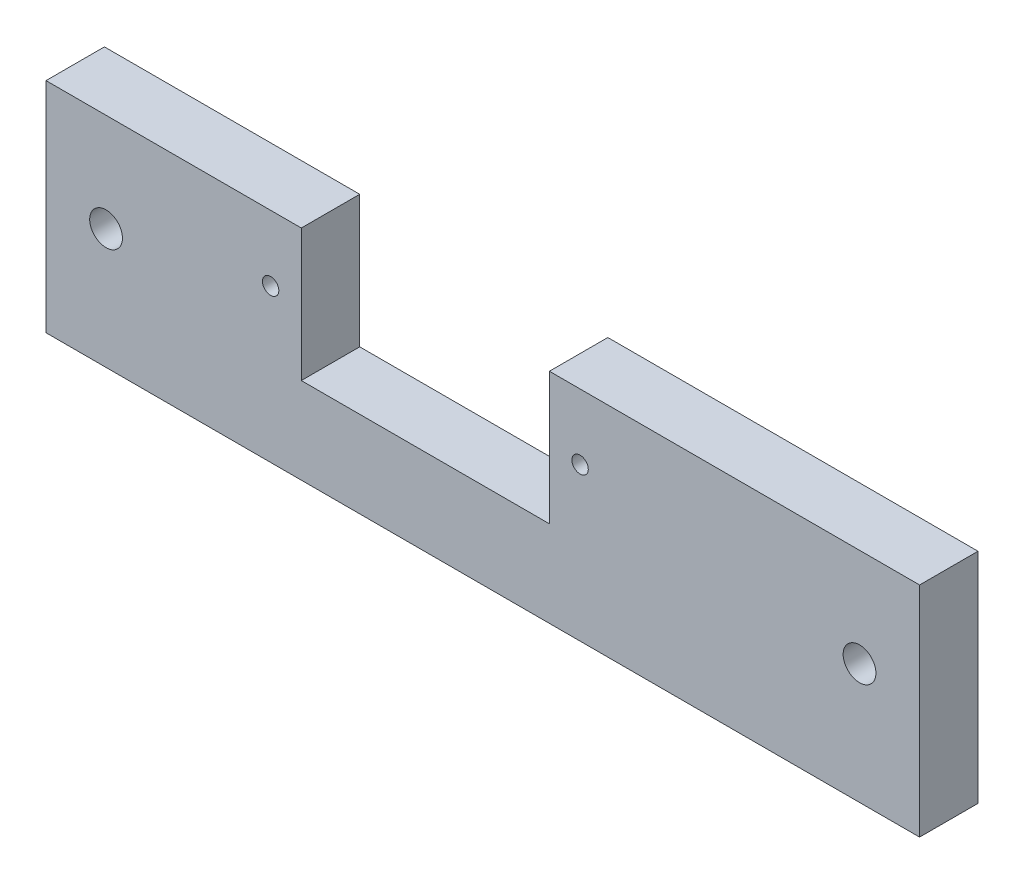
ISO-10303-21;
HEADER;
FILE_DESCRIPTION(('STEP AP214'),'2;1');
FILE_NAME('part.step','',(''),(''),'','','');
FILE_SCHEMA(('AUTOMOTIVE_DESIGN { 1 0 10303 214 1 1 1 1 }'));
ENDSEC;
DATA;
#1=APPLICATION_CONTEXT('core data for automotive mechanical design processes');
#2=APPLICATION_PROTOCOL_DEFINITION('international standard','automotive_design',2000,#1);
#3=PRODUCT_CONTEXT('',#1,'mechanical');
#4=PRODUCT('Part','Part','',(#3));
#5=PRODUCT_RELATED_PRODUCT_CATEGORY('part','',(#4));
#6=PRODUCT_DEFINITION_FORMATION('','',#4);
#7=PRODUCT_DEFINITION_CONTEXT('part definition',#1,'design');
#8=PRODUCT_DEFINITION('design','',#6,#7);
#9=PRODUCT_DEFINITION_SHAPE('','',#8);
#10=(LENGTH_UNIT() NAMED_UNIT(*) SI_UNIT(.MILLI.,.METRE.));
#11=(NAMED_UNIT(*) PLANE_ANGLE_UNIT() SI_UNIT($,.RADIAN.));
#12=(NAMED_UNIT(*) SI_UNIT($,.STERADIAN.) SOLID_ANGLE_UNIT());
#13=UNCERTAINTY_MEASURE_WITH_UNIT(LENGTH_MEASURE(1.E-05),#10,'distance_accuracy_value','');
#14=(GEOMETRIC_REPRESENTATION_CONTEXT(3) GLOBAL_UNCERTAINTY_ASSIGNED_CONTEXT((#13)) GLOBAL_UNIT_ASSIGNED_CONTEXT((#10,
#11,#12)) REPRESENTATION_CONTEXT('',''));
#15=CARTESIAN_POINT('',(0.,0.,0.));
#16=DIRECTION('',(0.,0.,1.));
#17=DIRECTION('',(1.,0.,0.));
#18=AXIS2_PLACEMENT_3D('',#15,#16,#17);
#19=CARTESIAN_POINT('',(0.,20.,5.35));
#20=DIRECTION('',(0.,1.,0.));
#21=DIRECTION('',(0.,0.,1.));
#22=AXIS2_PLACEMENT_3D('',#19,#20,#21);
#23=PLANE('',#22);
#24=DIRECTION('',(1.,0.,0.));
#25=VECTOR('',#24,1.);
#26=CARTESIAN_POINT('',(0.,20.,0.));
#27=LINE('',#26,#25);
#28=CARTESIAN_POINT('',(46.1,20.,0.));
#29=VERTEX_POINT('',#28);
#30=CARTESIAN_POINT('',(80.,20.,0.));
#31=VERTEX_POINT('',#30);
#32=EDGE_CURVE('E147',#29,#31,#27,.T.);
#33=ORIENTED_EDGE('',*,*,#32,.F.);
#34=DIRECTION('',(0.,0.,-1.));
#35=VECTOR('',#34,1.);
#36=CARTESIAN_POINT('',(46.1,20.,5.35));
#37=LINE('',#36,#35);
#38=CARTESIAN_POINT('',(46.1,20.,5.35));
#39=VERTEX_POINT('',#38);
#40=EDGE_CURVE('E11',#39,#29,#37,.T.);
#41=ORIENTED_EDGE('',*,*,#40,.F.);
#42=DIRECTION('',(1.,0.,0.));
#43=VECTOR('',#42,1.);
#44=CARTESIAN_POINT('',(0.,20.,5.35));
#45=LINE('',#44,#43);
#46=CARTESIAN_POINT('',(80.,20.,5.35));
#47=VERTEX_POINT('',#46);
#48=EDGE_CURVE('E200',#39,#47,#45,.T.);
#49=ORIENTED_EDGE('',*,*,#48,.T.);
#50=DIRECTION('',(0.,0.,-1.));
#51=VECTOR('',#50,1.);
#52=CARTESIAN_POINT('',(80.,20.,5.35));
#53=LINE('',#52,#51);
#54=EDGE_CURVE('E87',#47,#31,#53,.T.);
#55=ORIENTED_EDGE('',*,*,#54,.T.);
#56=EDGE_LOOP('',(#33,#41,#49,#55));
#57=FACE_BOUND('',#56,.T.);
#58=ADVANCED_FACE('F35',(#57),#23,.T.);
#59=CARTESIAN_POINT('',(46.1,0.,5.35));
#60=DIRECTION('',(1.,0.,0.));
#61=DIRECTION('',(0.,0.,-1.));
#62=AXIS2_PLACEMENT_3D('',#59,#60,#61);
#63=PLANE('',#62);
#64=DIRECTION('',(0.,-1.,0.));
#65=VECTOR('',#64,1.);
#66=CARTESIAN_POINT('',(46.1,0.,0.));
#67=LINE('',#66,#65);
#68=CARTESIAN_POINT('',(46.1,7.9,0.));
#69=VERTEX_POINT('',#68);
#70=EDGE_CURVE('E149',#29,#69,#67,.T.);
#71=ORIENTED_EDGE('',*,*,#70,.T.);
#72=DIRECTION('',(0.,0.,-1.));
#73=VECTOR('',#72,1.);
#74=CARTESIAN_POINT('',(46.1,7.9,5.35));
#75=LINE('',#74,#73);
#76=CARTESIAN_POINT('',(46.1,7.9,5.35));
#77=VERTEX_POINT('',#76);
#78=EDGE_CURVE('E44',#77,#69,#75,.T.);
#79=ORIENTED_EDGE('',*,*,#78,.F.);
#80=DIRECTION('',(0.,-1.,0.));
#81=VECTOR('',#80,1.);
#82=CARTESIAN_POINT('',(46.1,0.,5.35));
#83=LINE('',#82,#81);
#84=EDGE_CURVE('E198',#39,#77,#83,.T.);
#85=ORIENTED_EDGE('',*,*,#84,.F.);
#86=ORIENTED_EDGE('',*,*,#40,.T.);
#87=EDGE_LOOP('',(#71,#79,#85,#86));
#88=FACE_BOUND('',#87,.T.);
#89=ADVANCED_FACE('F190',(#88),#63,.F.);
#90=CARTESIAN_POINT('',(0.,7.9,5.35));
#91=DIRECTION('',(0.,1.,0.));
#92=DIRECTION('',(0.,0.,1.));
#93=AXIS2_PLACEMENT_3D('',#90,#91,#92);
#94=PLANE('',#93);
#95=DIRECTION('',(1.,0.,0.));
#96=VECTOR('',#95,1.);
#97=CARTESIAN_POINT('',(0.,7.9,0.));
#98=LINE('',#97,#96);
#99=CARTESIAN_POINT('',(23.38,7.9,0.));
#100=VERTEX_POINT('',#99);
#101=EDGE_CURVE('E152',#100,#69,#98,.T.);
#102=ORIENTED_EDGE('',*,*,#101,.F.);
#103=DIRECTION('',(0.,0.,-1.));
#104=VECTOR('',#103,1.);
#105=CARTESIAN_POINT('',(23.38,7.9,5.35));
#106=LINE('',#105,#104);
#107=CARTESIAN_POINT('',(23.38,7.9,5.35));
#108=VERTEX_POINT('',#107);
#109=EDGE_CURVE('E180',#108,#100,#106,.T.);
#110=ORIENTED_EDGE('',*,*,#109,.F.);
#111=DIRECTION('',(1.,0.,0.));
#112=VECTOR('',#111,1.);
#113=CARTESIAN_POINT('',(0.,7.9,5.35));
#114=LINE('',#113,#112);
#115=EDGE_CURVE('E187',#108,#77,#114,.T.);
#116=ORIENTED_EDGE('',*,*,#115,.T.);
#117=ORIENTED_EDGE('',*,*,#78,.T.);
#118=EDGE_LOOP('',(#102,#110,#116,#117));
#119=FACE_BOUND('',#118,.T.);
#120=ADVANCED_FACE('F185',(#119),#94,.T.);
#121=CARTESIAN_POINT('',(23.38,0.,5.35));
#122=DIRECTION('',(1.,0.,0.));
#123=DIRECTION('',(0.,0.,-1.));
#124=AXIS2_PLACEMENT_3D('',#121,#122,#123);
#125=PLANE('',#124);
#126=DIRECTION('',(0.,-1.,0.));
#127=VECTOR('',#126,1.);
#128=CARTESIAN_POINT('',(23.38,0.,0.));
#129=LINE('',#128,#127);
#130=CARTESIAN_POINT('',(23.38,20.,0.));
#131=VERTEX_POINT('',#130);
#132=EDGE_CURVE('E155',#131,#100,#129,.T.);
#133=ORIENTED_EDGE('',*,*,#132,.F.);
#134=DIRECTION('',(0.,0.,-1.));
#135=VECTOR('',#134,1.);
#136=CARTESIAN_POINT('',(23.38,20.,5.35));
#137=LINE('',#136,#135);
#138=CARTESIAN_POINT('',(23.38,20.,5.35));
#139=VERTEX_POINT('',#138);
#140=EDGE_CURVE('E178',#139,#131,#137,.T.);
#141=ORIENTED_EDGE('',*,*,#140,.F.);
#142=DIRECTION('',(0.,-1.,0.));
#143=VECTOR('',#142,1.);
#144=CARTESIAN_POINT('',(23.38,0.,5.35));
#145=LINE('',#144,#143);
#146=EDGE_CURVE('E130',#139,#108,#145,.T.);
#147=ORIENTED_EDGE('',*,*,#146,.T.);
#148=ORIENTED_EDGE('',*,*,#109,.T.);
#149=EDGE_LOOP('',(#133,#141,#147,#148));
#150=FACE_BOUND('',#149,.T.);
#151=ADVANCED_FACE('F196',(#150),#125,.T.);
#152=CARTESIAN_POINT('',(0.,20.,5.35));
#153=DIRECTION('',(0.,1.,0.));
#154=DIRECTION('',(0.,0.,1.));
#155=AXIS2_PLACEMENT_3D('',#152,#153,#154);
#156=PLANE('',#155);
#157=DIRECTION('',(1.,0.,0.));
#158=VECTOR('',#157,1.);
#159=CARTESIAN_POINT('',(0.,20.,0.));
#160=LINE('',#159,#158);
#161=CARTESIAN_POINT('',(0.,20.,0.));
#162=VERTEX_POINT('',#161);
#163=EDGE_CURVE('E158',#162,#131,#160,.T.);
#164=ORIENTED_EDGE('',*,*,#163,.F.);
#165=DIRECTION('',(0.,0.,-1.));
#166=VECTOR('',#165,1.);
#167=CARTESIAN_POINT('',(0.,20.,5.35));
#168=LINE('',#167,#166);
#169=CARTESIAN_POINT('',(0.,20.,5.35));
#170=VERTEX_POINT('',#169);
#171=EDGE_CURVE('E116',#170,#162,#168,.T.);
#172=ORIENTED_EDGE('',*,*,#171,.F.);
#173=DIRECTION('',(1.,0.,0.));
#174=VECTOR('',#173,1.);
#175=CARTESIAN_POINT('',(0.,20.,5.35));
#176=LINE('',#175,#174);
#177=EDGE_CURVE('E128',#170,#139,#176,.T.);
#178=ORIENTED_EDGE('',*,*,#177,.T.);
#179=ORIENTED_EDGE('',*,*,#140,.T.);
#180=EDGE_LOOP('',(#164,#172,#178,#179));
#181=FACE_BOUND('',#180,.T.);
#182=ADVANCED_FACE('F231',(#181),#156,.T.);
#183=CARTESIAN_POINT('',(0.,0.,5.35));
#184=DIRECTION('',(-1.,0.,0.));
#185=DIRECTION('',(0.,0.,1.));
#186=AXIS2_PLACEMENT_3D('',#183,#184,#185);
#187=PLANE('',#186);
#188=DIRECTION('',(0.,1.,0.));
#189=VECTOR('',#188,1.);
#190=CARTESIAN_POINT('',(0.,0.,0.));
#191=LINE('',#190,#189);
#192=CARTESIAN_POINT('',(0.,0.,0.));
#193=VERTEX_POINT('',#192);
#194=EDGE_CURVE('E113',#193,#162,#191,.T.);
#195=ORIENTED_EDGE('',*,*,#194,.F.);
#196=DIRECTION('',(0.,0.,-1.));
#197=VECTOR('',#196,1.);
#198=CARTESIAN_POINT('',(0.,0.,5.35));
#199=LINE('',#198,#197);
#200=CARTESIAN_POINT('',(0.,0.,5.35));
#201=VERTEX_POINT('',#200);
#202=EDGE_CURVE('E107',#201,#193,#199,.T.);
#203=ORIENTED_EDGE('',*,*,#202,.F.);
#204=DIRECTION('',(0.,1.,0.));
#205=VECTOR('',#204,1.);
#206=CARTESIAN_POINT('',(0.,0.,5.35));
#207=LINE('',#206,#205);
#208=EDGE_CURVE('E111',#201,#170,#207,.T.);
#209=ORIENTED_EDGE('',*,*,#208,.T.);
#210=ORIENTED_EDGE('',*,*,#171,.T.);
#211=EDGE_LOOP('',(#195,#203,#209,#210));
#212=FACE_BOUND('',#211,.T.);
#213=ADVANCED_FACE('F109',(#212),#187,.T.);
#214=CARTESIAN_POINT('',(0.,0.,5.35));
#215=DIRECTION('',(0.,1.,0.));
#216=DIRECTION('',(0.,0.,1.));
#217=AXIS2_PLACEMENT_3D('',#214,#215,#216);
#218=PLANE('',#217);
#219=DIRECTION('',(1.,0.,0.));
#220=VECTOR('',#219,1.);
#221=CARTESIAN_POINT('',(0.,0.,0.));
#222=LINE('',#221,#220);
#223=CARTESIAN_POINT('',(80.,0.,0.));
#224=VERTEX_POINT('',#223);
#225=EDGE_CURVE('E162',#193,#224,#222,.T.);
#226=ORIENTED_EDGE('',*,*,#225,.T.);
#227=DIRECTION('',(0.,0.,-1.));
#228=VECTOR('',#227,1.);
#229=CARTESIAN_POINT('',(80.,0.,5.35));
#230=LINE('',#229,#228);
#231=CARTESIAN_POINT('',(80.,0.,5.35));
#232=VERTEX_POINT('',#231);
#233=EDGE_CURVE('E117',#232,#224,#230,.T.);
#234=ORIENTED_EDGE('',*,*,#233,.F.);
#235=DIRECTION('',(1.,0.,0.));
#236=VECTOR('',#235,1.);
#237=CARTESIAN_POINT('',(0.,0.,5.35));
#238=LINE('',#237,#236);
#239=EDGE_CURVE('E120',#201,#232,#238,.T.);
#240=ORIENTED_EDGE('',*,*,#239,.F.);
#241=ORIENTED_EDGE('',*,*,#202,.T.);
#242=EDGE_LOOP('',(#226,#234,#240,#241));
#243=FACE_BOUND('',#242,.T.);
#244=ADVANCED_FACE('F121',(#243),#218,.F.);
#245=CARTESIAN_POINT('',(20.57,14.,5.35));
#246=DIRECTION('',(0.,0.,-1.));
#247=DIRECTION('',(-1.,0.,0.));
#248=AXIS2_PLACEMENT_3D('',#245,#246,#247);
#249=CYLINDRICAL_SURFACE('',#248,0.750000000000002);
#250=CARTESIAN_POINT('',(20.57,14.,5.35));
#251=DIRECTION('',(0.,0.,1.));
#252=DIRECTION('',(1.,0.,0.));
#253=AXIS2_PLACEMENT_3D('',#250,#251,#252);
#254=CIRCLE('',#253,0.750000000000002);
#255=CARTESIAN_POINT('',(21.32,14.,5.35));
#256=VERTEX_POINT('',#255);
#257=EDGE_CURVE('E138',#256,#256,#254,.T.);
#258=ORIENTED_EDGE('',*,*,#257,.T.);
#259=EDGE_LOOP('',(#258));
#260=FACE_BOUND('',#259,.T.);
#261=CARTESIAN_POINT('',(20.57,14.,0.));
#262=DIRECTION('',(0.,0.,1.));
#263=DIRECTION('',(1.,0.,0.));
#264=AXIS2_PLACEMENT_3D('',#261,#262,#263);
#265=CIRCLE('',#264,0.750000000000002);
#266=CARTESIAN_POINT('',(21.32,14.,0.));
#267=VERTEX_POINT('',#266);
#268=EDGE_CURVE('E168',#267,#267,#265,.T.);
#269=ORIENTED_EDGE('',*,*,#268,.F.);
#270=EDGE_LOOP('',(#269));
#271=FACE_BOUND('',#270,.T.);
#272=ADVANCED_FACE('F239',(#260,#271),#249,.F.);
#273=CARTESIAN_POINT('',(5.5,11.,5.35));
#274=DIRECTION('',(0.,0.,-1.));
#275=DIRECTION('',(-1.,0.,0.));
#276=AXIS2_PLACEMENT_3D('',#273,#274,#275);
#277=CYLINDRICAL_SURFACE('',#276,1.5);
#278=CARTESIAN_POINT('',(5.5,11.,5.35));
#279=DIRECTION('',(0.,0.,1.));
#280=DIRECTION('',(1.,0.,0.));
#281=AXIS2_PLACEMENT_3D('',#278,#279,#280);
#282=CIRCLE('',#281,1.5);
#283=CARTESIAN_POINT('',(7.,11.,5.35));
#284=VERTEX_POINT('',#283);
#285=EDGE_CURVE('E135',#284,#284,#282,.T.);
#286=ORIENTED_EDGE('',*,*,#285,.T.);
#287=EDGE_LOOP('',(#286));
#288=FACE_BOUND('',#287,.T.);
#289=CARTESIAN_POINT('',(5.5,11.,0.));
#290=DIRECTION('',(0.,0.,1.));
#291=DIRECTION('',(1.,0.,0.));
#292=AXIS2_PLACEMENT_3D('',#289,#290,#291);
#293=CIRCLE('',#292,1.5);
#294=CARTESIAN_POINT('',(7.,11.,0.));
#295=VERTEX_POINT('',#294);
#296=EDGE_CURVE('E165',#295,#295,#293,.T.);
#297=ORIENTED_EDGE('',*,*,#296,.F.);
#298=EDGE_LOOP('',(#297));
#299=FACE_BOUND('',#298,.T.);
#300=ADVANCED_FACE('F242',(#288,#299),#277,.F.);
#301=CARTESIAN_POINT('',(80.,0.,5.35));
#302=DIRECTION('',(-1.,0.,0.));
#303=DIRECTION('',(0.,0.,1.));
#304=AXIS2_PLACEMENT_3D('',#301,#302,#303);
#305=PLANE('',#304);
#306=DIRECTION('',(0.,1.,0.));
#307=VECTOR('',#306,1.);
#308=CARTESIAN_POINT('',(80.,0.,0.));
#309=LINE('',#308,#307);
#310=EDGE_CURVE('E80',#224,#31,#309,.T.);
#311=ORIENTED_EDGE('',*,*,#310,.T.);
#312=ORIENTED_EDGE('',*,*,#54,.F.);
#313=DIRECTION('',(0.,1.,0.));
#314=VECTOR('',#313,1.);
#315=CARTESIAN_POINT('',(80.,0.,5.35));
#316=LINE('',#315,#314);
#317=EDGE_CURVE('E52',#232,#47,#316,.T.);
#318=ORIENTED_EDGE('',*,*,#317,.F.);
#319=ORIENTED_EDGE('',*,*,#233,.T.);
#320=EDGE_LOOP('',(#311,#312,#318,#319));
#321=FACE_BOUND('',#320,.T.);
#322=ADVANCED_FACE('F211',(#321),#305,.F.);
#323=CARTESIAN_POINT('',(74.5,11.,5.35));
#324=DIRECTION('',(0.,0.,-1.));
#325=DIRECTION('',(-1.,0.,0.));
#326=AXIS2_PLACEMENT_3D('',#323,#324,#325);
#327=CYLINDRICAL_SURFACE('',#326,1.50000000000001);
#328=CARTESIAN_POINT('',(74.5,11.,5.35));
#329=DIRECTION('',(0.,0.,1.));
#330=DIRECTION('',(1.,0.,0.));
#331=AXIS2_PLACEMENT_3D('',#328,#329,#330);
#332=CIRCLE('',#331,1.50000000000001);
#333=CARTESIAN_POINT('',(76.,11.,5.35));
#334=VERTEX_POINT('',#333);
#335=EDGE_CURVE('E174',#334,#334,#332,.F.);
#336=ORIENTED_EDGE('',*,*,#335,.F.);
#337=EDGE_LOOP('',(#336));
#338=FACE_BOUND('',#337,.T.);
#339=CARTESIAN_POINT('',(74.5,11.,0.));
#340=DIRECTION('',(0.,0.,1.));
#341=DIRECTION('',(1.,0.,0.));
#342=AXIS2_PLACEMENT_3D('',#339,#340,#341);
#343=CIRCLE('',#342,1.50000000000001);
#344=CARTESIAN_POINT('',(76.,11.,0.));
#345=VERTEX_POINT('',#344);
#346=EDGE_CURVE('E144',#345,#345,#343,.F.);
#347=ORIENTED_EDGE('',*,*,#346,.T.);
#348=EDGE_LOOP('',(#347));
#349=FACE_BOUND('',#348,.T.);
#350=ADVANCED_FACE('F37',(#338,#349),#327,.F.);
#351=CARTESIAN_POINT('',(48.91,14.,5.35));
#352=DIRECTION('',(0.,0.,-1.));
#353=DIRECTION('',(-1.,0.,0.));
#354=AXIS2_PLACEMENT_3D('',#351,#352,#353);
#355=CYLINDRICAL_SURFACE('',#354,0.750000000000005);
#356=CARTESIAN_POINT('',(48.91,14.,5.35));
#357=DIRECTION('',(0.,0.,1.));
#358=DIRECTION('',(1.,0.,0.));
#359=AXIS2_PLACEMENT_3D('',#356,#357,#358);
#360=CIRCLE('',#359,0.750000000000005);
#361=CARTESIAN_POINT('',(49.66,14.,5.35));
#362=VERTEX_POINT('',#361);
#363=EDGE_CURVE('E141',#362,#362,#360,.F.);
#364=ORIENTED_EDGE('',*,*,#363,.F.);
#365=EDGE_LOOP('',(#364));
#366=FACE_BOUND('',#365,.T.);
#367=CARTESIAN_POINT('',(48.91,14.,0.));
#368=DIRECTION('',(0.,0.,1.));
#369=DIRECTION('',(1.,0.,0.));
#370=AXIS2_PLACEMENT_3D('',#367,#368,#369);
#371=CIRCLE('',#370,0.750000000000005);
#372=CARTESIAN_POINT('',(49.66,14.,0.));
#373=VERTEX_POINT('',#372);
#374=EDGE_CURVE('E171',#373,#373,#371,.F.);
#375=ORIENTED_EDGE('',*,*,#374,.T.);
#376=EDGE_LOOP('',(#375));
#377=FACE_BOUND('',#376,.T.);
#378=ADVANCED_FACE('F210',(#366,#377),#355,.F.);
#379=CARTESIAN_POINT('',(0.,0.,5.35));
#380=DIRECTION('',(0.,0.,1.));
#381=DIRECTION('',(1.,0.,0.));
#382=AXIS2_PLACEMENT_3D('',#379,#380,#381);
#383=PLANE('',#382);
#384=ORIENTED_EDGE('',*,*,#335,.T.);
#385=EDGE_LOOP('',(#384));
#386=FACE_BOUND('',#385,.T.);
#387=ORIENTED_EDGE('',*,*,#48,.F.);
#388=ORIENTED_EDGE('',*,*,#84,.T.);
#389=ORIENTED_EDGE('',*,*,#115,.F.);
#390=ORIENTED_EDGE('',*,*,#146,.F.);
#391=ORIENTED_EDGE('',*,*,#177,.F.);
#392=ORIENTED_EDGE('',*,*,#208,.F.);
#393=ORIENTED_EDGE('',*,*,#239,.T.);
#394=ORIENTED_EDGE('',*,*,#317,.T.);
#395=EDGE_LOOP('',(#387,#388,#389,#390,#391,#392,#393,#394));
#396=FACE_BOUND('',#395,.T.);
#397=ORIENTED_EDGE('',*,*,#285,.F.);
#398=EDGE_LOOP('',(#397));
#399=FACE_BOUND('',#398,.T.);
#400=ORIENTED_EDGE('',*,*,#257,.F.);
#401=EDGE_LOOP('',(#400));
#402=FACE_BOUND('',#401,.T.);
#403=ORIENTED_EDGE('',*,*,#363,.T.);
#404=EDGE_LOOP('',(#403));
#405=FACE_BOUND('',#404,.T.);
#406=ADVANCED_FACE('F124',(#386,#396,#399,#402,#405),#383,.T.);
#407=CARTESIAN_POINT('',(0.,0.,0.));
#408=DIRECTION('',(0.,0.,1.));
#409=DIRECTION('',(1.,0.,0.));
#410=AXIS2_PLACEMENT_3D('',#407,#408,#409);
#411=PLANE('',#410);
#412=ORIENTED_EDGE('',*,*,#346,.F.);
#413=EDGE_LOOP('',(#412));
#414=FACE_BOUND('',#413,.T.);
#415=ORIENTED_EDGE('',*,*,#32,.T.);
#416=ORIENTED_EDGE('',*,*,#310,.F.);
#417=ORIENTED_EDGE('',*,*,#225,.F.);
#418=ORIENTED_EDGE('',*,*,#194,.T.);
#419=ORIENTED_EDGE('',*,*,#163,.T.);
#420=ORIENTED_EDGE('',*,*,#132,.T.);
#421=ORIENTED_EDGE('',*,*,#101,.T.);
#422=ORIENTED_EDGE('',*,*,#70,.F.);
#423=EDGE_LOOP('',(#415,#416,#417,#418,#419,#420,#421,#422));
#424=FACE_BOUND('',#423,.T.);
#425=ORIENTED_EDGE('',*,*,#296,.T.);
#426=EDGE_LOOP('',(#425));
#427=FACE_BOUND('',#426,.T.);
#428=ORIENTED_EDGE('',*,*,#268,.T.);
#429=EDGE_LOOP('',(#428));
#430=FACE_BOUND('',#429,.T.);
#431=ORIENTED_EDGE('',*,*,#374,.F.);
#432=EDGE_LOOP('',(#431));
#433=FACE_BOUND('',#432,.T.);
#434=ADVANCED_FACE('F191',(#414,#424,#427,#430,#433),#411,.F.);
#435=CLOSED_SHELL('',(#58,#89,#120,#151,#182,#213,#244,#272,#300,#322,#350,#378,#406,#434));
#436=MANIFOLD_SOLID_BREP('B2',#435);
#437=ADVANCED_BREP_SHAPE_REPRESENTATION('',(#18,#436),#14);
#438=SHAPE_DEFINITION_REPRESENTATION(#9,#437);
ENDSEC;
END-ISO-10303-21;
